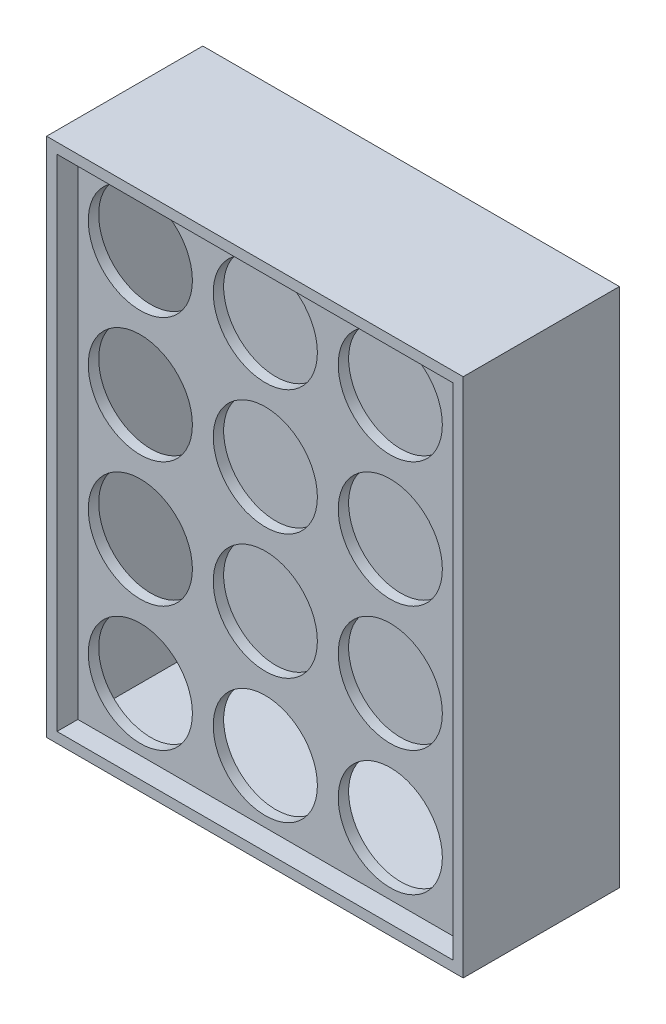
ISO-10303-21;
HEADER;
FILE_DESCRIPTION(('STEP AP214'),'2;1');
FILE_NAME('part.step','',(''),(''),'','','');
FILE_SCHEMA(('AUTOMOTIVE_DESIGN { 1 0 10303 214 1 1 1 1 }'));
ENDSEC;
DATA;
#1=APPLICATION_CONTEXT('core data for automotive mechanical design processes');
#2=APPLICATION_PROTOCOL_DEFINITION('international standard','automotive_design',2000,#1);
#3=PRODUCT_CONTEXT('',#1,'mechanical');
#4=PRODUCT('Part','Part','',(#3));
#5=PRODUCT_RELATED_PRODUCT_CATEGORY('part','',(#4));
#6=PRODUCT_DEFINITION_FORMATION('','',#4);
#7=PRODUCT_DEFINITION_CONTEXT('part definition',#1,'design');
#8=PRODUCT_DEFINITION('design','',#6,#7);
#9=PRODUCT_DEFINITION_SHAPE('','',#8);
#10=(LENGTH_UNIT() NAMED_UNIT(*) SI_UNIT(.MILLI.,.METRE.));
#11=(NAMED_UNIT(*) PLANE_ANGLE_UNIT() SI_UNIT($,.RADIAN.));
#12=(NAMED_UNIT(*) SI_UNIT($,.STERADIAN.) SOLID_ANGLE_UNIT());
#13=UNCERTAINTY_MEASURE_WITH_UNIT(LENGTH_MEASURE(1.E-05),#10,'distance_accuracy_value','');
#14=(GEOMETRIC_REPRESENTATION_CONTEXT(3) GLOBAL_UNCERTAINTY_ASSIGNED_CONTEXT((#13)) GLOBAL_UNIT_ASSIGNED_CONTEXT((#10,
#11,#12)) REPRESENTATION_CONTEXT('',''));
#15=CARTESIAN_POINT('',(0.,0.,0.));
#16=DIRECTION('',(0.,0.,1.));
#17=DIRECTION('',(1.,0.,0.));
#18=AXIS2_PLACEMENT_3D('',#15,#16,#17);
#19=CARTESIAN_POINT('',(0.,0.,5.));
#20=DIRECTION('',(0.,0.,1.));
#21=DIRECTION('',(1.,0.,0.));
#22=AXIS2_PLACEMENT_3D('',#19,#20,#21);
#23=PLANE('',#22);
#24=DIRECTION('',(-1.,0.,0.));
#25=VECTOR('',#24,1.);
#26=CARTESIAN_POINT('',(5.,-5.,5.));
#27=LINE('',#26,#25);
#28=CARTESIAN_POINT('',(195.,-5.,5.));
#29=VERTEX_POINT('',#28);
#30=CARTESIAN_POINT('',(5.,-5.,5.));
#31=VERTEX_POINT('',#30);
#32=EDGE_CURVE('E143',#29,#31,#27,.T.);
#33=ORIENTED_EDGE('',*,*,#32,.T.);
#34=DIRECTION('',(0.,-1.,0.));
#35=VECTOR('',#34,1.);
#36=CARTESIAN_POINT('',(5.,-5.,5.));
#37=LINE('',#36,#35);
#38=CARTESIAN_POINT('',(5.,-245.,5.));
#39=VERTEX_POINT('',#38);
#40=EDGE_CURVE('E174',#31,#39,#37,.T.);
#41=ORIENTED_EDGE('',*,*,#40,.T.);
#42=DIRECTION('',(1.,0.,0.));
#43=VECTOR('',#42,1.);
#44=CARTESIAN_POINT('',(5.,-245.,5.));
#45=LINE('',#44,#43);
#46=CARTESIAN_POINT('',(195.,-245.,5.));
#47=VERTEX_POINT('',#46);
#48=EDGE_CURVE('E177',#39,#47,#45,.T.);
#49=ORIENTED_EDGE('',*,*,#48,.T.);
#50=DIRECTION('',(0.,1.,0.));
#51=VECTOR('',#50,1.);
#52=CARTESIAN_POINT('',(195.,-5.,5.));
#53=LINE('',#52,#51);
#54=EDGE_CURVE('E166',#47,#29,#53,.T.);
#55=ORIENTED_EDGE('',*,*,#54,.T.);
#56=EDGE_LOOP('',(#33,#41,#49,#55));
#57=FACE_BOUND('',#56,.T.);
#58=ADVANCED_FACE('F35',(#57),#23,.T.);
#59=CARTESIAN_POINT('',(195.,-5.,75.));
#60=DIRECTION('',(-1.,0.,0.));
#61=DIRECTION('',(0.,0.,1.));
#62=AXIS2_PLACEMENT_3D('',#59,#60,#61);
#63=PLANE('',#62);
#64=DIRECTION('',(0.,0.,-1.));
#65=VECTOR('',#64,1.);
#66=CARTESIAN_POINT('',(195.,-245.,75.));
#67=LINE('',#66,#65);
#68=CARTESIAN_POINT('',(195.,-245.,60.));
#69=VERTEX_POINT('',#68);
#70=EDGE_CURVE('E135',#69,#47,#67,.T.);
#71=ORIENTED_EDGE('',*,*,#70,.F.);
#72=DIRECTION('',(0.,1.,0.));
#73=VECTOR('',#72,1.);
#74=CARTESIAN_POINT('',(195.,-5.,60.));
#75=LINE('',#74,#73);
#76=CARTESIAN_POINT('',(195.,-5.,60.));
#77=VERTEX_POINT('',#76);
#78=EDGE_CURVE('E157',#69,#77,#75,.T.);
#79=ORIENTED_EDGE('',*,*,#78,.T.);
#80=DIRECTION('',(0.,0.,-1.));
#81=VECTOR('',#80,1.);
#82=CARTESIAN_POINT('',(195.,-5.,75.));
#83=LINE('',#82,#81);
#84=EDGE_CURVE('E136',#77,#29,#83,.T.);
#85=ORIENTED_EDGE('',*,*,#84,.T.);
#86=ORIENTED_EDGE('',*,*,#54,.F.);
#87=EDGE_LOOP('',(#71,#79,#85,#86));
#88=FACE_BOUND('',#87,.T.);
#89=ADVANCED_FACE('F243',(#88),#63,.T.);
#90=CARTESIAN_POINT('',(5.,-245.,75.));
#91=DIRECTION('',(0.,1.,0.));
#92=DIRECTION('',(0.,0.,1.));
#93=AXIS2_PLACEMENT_3D('',#90,#91,#92);
#94=PLANE('',#93);
#95=DIRECTION('',(0.,0.,-1.));
#96=VECTOR('',#95,1.);
#97=CARTESIAN_POINT('',(5.,-245.,75.));
#98=LINE('',#97,#96);
#99=CARTESIAN_POINT('',(5.,-245.,60.));
#100=VERTEX_POINT('',#99);
#101=EDGE_CURVE('E184',#100,#39,#98,.T.);
#102=ORIENTED_EDGE('',*,*,#101,.F.);
#103=DIRECTION('',(1.,0.,0.));
#104=VECTOR('',#103,1.);
#105=CARTESIAN_POINT('',(5.,-245.,60.));
#106=LINE('',#105,#104);
#107=EDGE_CURVE('E153',#100,#69,#106,.T.);
#108=ORIENTED_EDGE('',*,*,#107,.T.);
#109=ORIENTED_EDGE('',*,*,#70,.T.);
#110=ORIENTED_EDGE('',*,*,#48,.F.);
#111=EDGE_LOOP('',(#102,#108,#109,#110));
#112=FACE_BOUND('',#111,.T.);
#113=ADVANCED_FACE('F249',(#112),#94,.T.);
#114=CARTESIAN_POINT('',(5.,-5.,75.));
#115=DIRECTION('',(1.,0.,0.));
#116=DIRECTION('',(0.,0.,-1.));
#117=AXIS2_PLACEMENT_3D('',#114,#115,#116);
#118=PLANE('',#117);
#119=DIRECTION('',(0.,0.,-1.));
#120=VECTOR('',#119,1.);
#121=CARTESIAN_POINT('',(5.,-5.,75.));
#122=LINE('',#121,#120);
#123=CARTESIAN_POINT('',(5.,-5.,60.));
#124=VERTEX_POINT('',#123);
#125=EDGE_CURVE('E187',#124,#31,#122,.T.);
#126=ORIENTED_EDGE('',*,*,#125,.F.);
#127=DIRECTION('',(0.,-1.,0.));
#128=VECTOR('',#127,1.);
#129=CARTESIAN_POINT('',(5.,-5.,60.));
#130=LINE('',#129,#128);
#131=EDGE_CURVE('E150',#124,#100,#130,.T.);
#132=ORIENTED_EDGE('',*,*,#131,.T.);
#133=ORIENTED_EDGE('',*,*,#101,.T.);
#134=ORIENTED_EDGE('',*,*,#40,.F.);
#135=EDGE_LOOP('',(#126,#132,#133,#134));
#136=FACE_BOUND('',#135,.T.);
#137=ADVANCED_FACE('F287',(#136),#118,.T.);
#138=CARTESIAN_POINT('',(5.,-5.,75.));
#139=DIRECTION('',(0.,-1.,0.));
#140=DIRECTION('',(0.,0.,-1.));
#141=AXIS2_PLACEMENT_3D('',#138,#139,#140);
#142=PLANE('',#141);
#143=ORIENTED_EDGE('',*,*,#84,.F.);
#144=DIRECTION('',(-1.,0.,0.));
#145=VECTOR('',#144,1.);
#146=CARTESIAN_POINT('',(5.,-5.,60.));
#147=LINE('',#146,#145);
#148=EDGE_CURVE('E160',#77,#124,#147,.T.);
#149=ORIENTED_EDGE('',*,*,#148,.T.);
#150=ORIENTED_EDGE('',*,*,#125,.T.);
#151=ORIENTED_EDGE('',*,*,#32,.F.);
#152=EDGE_LOOP('',(#143,#149,#150,#151));
#153=FACE_BOUND('',#152,.T.);
#154=ADVANCED_FACE('F279',(#153),#142,.T.);
#155=CARTESIAN_POINT('',(0.,0.,60.));
#156=DIRECTION('',(0.,0.,1.));
#157=DIRECTION('',(1.,0.,0.));
#158=AXIS2_PLACEMENT_3D('',#155,#156,#157);
#159=PLANE('',#158);
#160=CARTESIAN_POINT('',(95.0000000000006,-95.,60.));
#161=DIRECTION('',(0.,0.,1.));
#162=DIRECTION('',(1.,0.,0.));
#163=AXIS2_PLACEMENT_3D('',#160,#161,#162);
#164=CIRCLE('',#163,25.);
#165=CARTESIAN_POINT('',(120.000000000001,-95.,60.));
#166=VERTEX_POINT('',#165);
#167=EDGE_CURVE('E523',#166,#166,#164,.T.);
#168=ORIENTED_EDGE('',*,*,#167,.T.);
#169=EDGE_LOOP('',(#168));
#170=FACE_BOUND('',#169,.T.);
#171=CARTESIAN_POINT('',(35.0000000000019,-215.,60.));
#172=DIRECTION('',(0.,0.,1.));
#173=DIRECTION('',(1.,0.,0.));
#174=AXIS2_PLACEMENT_3D('',#171,#172,#173);
#175=CIRCLE('',#174,25.);
#176=CARTESIAN_POINT('',(60.0000000000019,-215.,60.));
#177=VERTEX_POINT('',#176);
#178=EDGE_CURVE('E527',#177,#177,#175,.T.);
#179=ORIENTED_EDGE('',*,*,#178,.T.);
#180=EDGE_LOOP('',(#179));
#181=FACE_BOUND('',#180,.T.);
#182=CARTESIAN_POINT('',(35.0000000000012,-155.,60.));
#183=DIRECTION('',(0.,0.,1.));
#184=DIRECTION('',(1.,0.,0.));
#185=AXIS2_PLACEMENT_3D('',#182,#183,#184);
#186=CIRCLE('',#185,25.);
#187=CARTESIAN_POINT('',(60.0000000000012,-155.,60.));
#188=VERTEX_POINT('',#187);
#189=EDGE_CURVE('E531',#188,#188,#186,.T.);
#190=ORIENTED_EDGE('',*,*,#189,.T.);
#191=EDGE_LOOP('',(#190));
#192=FACE_BOUND('',#191,.T.);
#193=CARTESIAN_POINT('',(35.0000000000006,-95.,60.));
#194=DIRECTION('',(0.,0.,1.));
#195=DIRECTION('',(1.,0.,0.));
#196=AXIS2_PLACEMENT_3D('',#193,#194,#195);
#197=CIRCLE('',#196,25.);
#198=CARTESIAN_POINT('',(60.0000000000006,-95.,60.));
#199=VERTEX_POINT('',#198);
#200=EDGE_CURVE('E535',#199,#199,#197,.T.);
#201=ORIENTED_EDGE('',*,*,#200,.T.);
#202=EDGE_LOOP('',(#201));
#203=FACE_BOUND('',#202,.T.);
#204=CARTESIAN_POINT('',(155.000000000002,-215.,60.));
#205=DIRECTION('',(0.,0.,1.));
#206=DIRECTION('',(1.,0.,0.));
#207=AXIS2_PLACEMENT_3D('',#204,#205,#206);
#208=CIRCLE('',#207,25.);
#209=CARTESIAN_POINT('',(180.000000000002,-215.,60.));
#210=VERTEX_POINT('',#209);
#211=EDGE_CURVE('E539',#210,#210,#208,.T.);
#212=ORIENTED_EDGE('',*,*,#211,.T.);
#213=EDGE_LOOP('',(#212));
#214=FACE_BOUND('',#213,.T.);
#215=CARTESIAN_POINT('',(95.0000000000019,-215.,60.));
#216=DIRECTION('',(0.,0.,1.));
#217=DIRECTION('',(1.,0.,0.));
#218=AXIS2_PLACEMENT_3D('',#215,#216,#217);
#219=CIRCLE('',#218,25.);
#220=CARTESIAN_POINT('',(120.000000000002,-215.,60.));
#221=VERTEX_POINT('',#220);
#222=EDGE_CURVE('E543',#221,#221,#219,.T.);
#223=ORIENTED_EDGE('',*,*,#222,.T.);
#224=EDGE_LOOP('',(#223));
#225=FACE_BOUND('',#224,.T.);
#226=CARTESIAN_POINT('',(155.000000000001,-155.,60.));
#227=DIRECTION('',(0.,0.,1.));
#228=DIRECTION('',(1.,0.,0.));
#229=AXIS2_PLACEMENT_3D('',#226,#227,#228);
#230=CIRCLE('',#229,25.);
#231=CARTESIAN_POINT('',(180.000000000001,-155.,60.));
#232=VERTEX_POINT('',#231);
#233=EDGE_CURVE('E547',#232,#232,#230,.T.);
#234=ORIENTED_EDGE('',*,*,#233,.T.);
#235=EDGE_LOOP('',(#234));
#236=FACE_BOUND('',#235,.T.);
#237=CARTESIAN_POINT('',(95.0000000000013,-155.,60.));
#238=DIRECTION('',(0.,0.,1.));
#239=DIRECTION('',(1.,0.,0.));
#240=AXIS2_PLACEMENT_3D('',#237,#238,#239);
#241=CIRCLE('',#240,25.);
#242=CARTESIAN_POINT('',(120.000000000001,-155.,60.));
#243=VERTEX_POINT('',#242);
#244=EDGE_CURVE('E551',#243,#243,#241,.T.);
#245=ORIENTED_EDGE('',*,*,#244,.T.);
#246=EDGE_LOOP('',(#245));
#247=FACE_BOUND('',#246,.T.);
#248=CARTESIAN_POINT('',(155.000000000001,-95.,60.));
#249=DIRECTION('',(0.,0.,1.));
#250=DIRECTION('',(1.,0.,0.));
#251=AXIS2_PLACEMENT_3D('',#248,#249,#250);
#252=CIRCLE('',#251,25.);
#253=CARTESIAN_POINT('',(180.000000000001,-95.,60.));
#254=VERTEX_POINT('',#253);
#255=EDGE_CURVE('E555',#254,#254,#252,.T.);
#256=ORIENTED_EDGE('',*,*,#255,.T.);
#257=EDGE_LOOP('',(#256));
#258=FACE_BOUND('',#257,.T.);
#259=CARTESIAN_POINT('',(155.,-35.,60.));
#260=DIRECTION('',(0.,0.,1.));
#261=DIRECTION('',(1.,0.,0.));
#262=AXIS2_PLACEMENT_3D('',#259,#260,#261);
#263=CIRCLE('',#262,25.);
#264=CARTESIAN_POINT('',(180.,-35.,60.));
#265=VERTEX_POINT('',#264);
#266=EDGE_CURVE('E559',#265,#265,#263,.T.);
#267=ORIENTED_EDGE('',*,*,#266,.T.);
#268=EDGE_LOOP('',(#267));
#269=FACE_BOUND('',#268,.T.);
#270=CARTESIAN_POINT('',(95.,-35.,60.));
#271=DIRECTION('',(0.,0.,1.));
#272=DIRECTION('',(1.,0.,0.));
#273=AXIS2_PLACEMENT_3D('',#270,#271,#272);
#274=CIRCLE('',#273,25.);
#275=CARTESIAN_POINT('',(120.,-35.,60.));
#276=VERTEX_POINT('',#275);
#277=EDGE_CURVE('E563',#276,#276,#274,.T.);
#278=ORIENTED_EDGE('',*,*,#277,.T.);
#279=EDGE_LOOP('',(#278));
#280=FACE_BOUND('',#279,.T.);
#281=CARTESIAN_POINT('',(35.,-35.,60.));
#282=DIRECTION('',(0.,0.,1.));
#283=DIRECTION('',(1.,0.,0.));
#284=AXIS2_PLACEMENT_3D('',#281,#282,#283);
#285=CIRCLE('',#284,25.);
#286=CARTESIAN_POINT('',(60.,-35.,60.));
#287=VERTEX_POINT('',#286);
#288=EDGE_CURVE('E154',#287,#287,#285,.T.);
#289=ORIENTED_EDGE('',*,*,#288,.T.);
#290=EDGE_LOOP('',(#289));
#291=FACE_BOUND('',#290,.T.);
#292=ORIENTED_EDGE('',*,*,#131,.F.);
#293=ORIENTED_EDGE('',*,*,#148,.F.);
#294=ORIENTED_EDGE('',*,*,#78,.F.);
#295=ORIENTED_EDGE('',*,*,#107,.F.);
#296=EDGE_LOOP('',(#292,#293,#294,#295));
#297=FACE_BOUND('',#296,.T.);
#298=ADVANCED_FACE('F414',(#170,#181,#192,#203,#214,#225,#236,#247,#258,#269,#280,#291,#297),
#159,.F.);
#299=CARTESIAN_POINT('',(35.,-35.,60.));
#300=DIRECTION('',(0.,0.,1.));
#301=DIRECTION('',(1.,0.,0.));
#302=AXIS2_PLACEMENT_3D('',#299,#300,#301);
#303=CYLINDRICAL_SURFACE('',#302,25.);
#304=ORIENTED_EDGE('',*,*,#288,.F.);
#305=EDGE_LOOP('',(#304));
#306=FACE_BOUND('',#305,.T.);
#307=CARTESIAN_POINT('',(35.,-35.,65.));
#308=DIRECTION('',(0.,0.,1.));
#309=DIRECTION('',(1.,0.,0.));
#310=AXIS2_PLACEMENT_3D('',#307,#308,#309);
#311=CIRCLE('',#310,25.);
#312=CARTESIAN_POINT('',(60.,-35.,65.));
#313=VERTEX_POINT('',#312);
#314=EDGE_CURVE('E566',#313,#313,#311,.T.);
#315=ORIENTED_EDGE('',*,*,#314,.T.);
#316=EDGE_LOOP('',(#315));
#317=FACE_BOUND('',#316,.T.);
#318=ADVANCED_FACE('F405',(#306,#317),#303,.F.);
#319=CARTESIAN_POINT('',(95.,-35.,60.));
#320=DIRECTION('',(0.,0.,1.));
#321=DIRECTION('',(1.,0.,0.));
#322=AXIS2_PLACEMENT_3D('',#319,#320,#321);
#323=CYLINDRICAL_SURFACE('',#322,25.);
#324=ORIENTED_EDGE('',*,*,#277,.F.);
#325=EDGE_LOOP('',(#324));
#326=FACE_BOUND('',#325,.T.);
#327=CARTESIAN_POINT('',(95.,-35.,65.));
#328=DIRECTION('',(0.,0.,1.));
#329=DIRECTION('',(1.,0.,0.));
#330=AXIS2_PLACEMENT_3D('',#327,#328,#329);
#331=CIRCLE('',#330,25.);
#332=CARTESIAN_POINT('',(120.,-35.,65.));
#333=VERTEX_POINT('',#332);
#334=EDGE_CURVE('E611',#333,#333,#331,.T.);
#335=ORIENTED_EDGE('',*,*,#334,.T.);
#336=EDGE_LOOP('',(#335));
#337=FACE_BOUND('',#336,.T.);
#338=ADVANCED_FACE('F396',(#326,#337),#323,.F.);
#339=CARTESIAN_POINT('',(155.,-35.,60.));
#340=DIRECTION('',(0.,0.,1.));
#341=DIRECTION('',(1.,0.,0.));
#342=AXIS2_PLACEMENT_3D('',#339,#340,#341);
#343=CYLINDRICAL_SURFACE('',#342,25.);
#344=ORIENTED_EDGE('',*,*,#266,.F.);
#345=EDGE_LOOP('',(#344));
#346=FACE_BOUND('',#345,.T.);
#347=CARTESIAN_POINT('',(155.,-35.,65.));
#348=DIRECTION('',(0.,0.,1.));
#349=DIRECTION('',(1.,0.,0.));
#350=AXIS2_PLACEMENT_3D('',#347,#348,#349);
#351=CIRCLE('',#350,25.);
#352=CARTESIAN_POINT('',(180.,-35.,65.));
#353=VERTEX_POINT('',#352);
#354=EDGE_CURVE('E607',#353,#353,#351,.T.);
#355=ORIENTED_EDGE('',*,*,#354,.T.);
#356=EDGE_LOOP('',(#355));
#357=FACE_BOUND('',#356,.T.);
#358=ADVANCED_FACE('F387',(#346,#357),#343,.F.);
#359=CARTESIAN_POINT('',(155.000000000001,-95.,60.));
#360=DIRECTION('',(0.,0.,1.));
#361=DIRECTION('',(1.,0.,0.));
#362=AXIS2_PLACEMENT_3D('',#359,#360,#361);
#363=CYLINDRICAL_SURFACE('',#362,25.);
#364=ORIENTED_EDGE('',*,*,#255,.F.);
#365=EDGE_LOOP('',(#364));
#366=FACE_BOUND('',#365,.T.);
#367=CARTESIAN_POINT('',(155.000000000001,-95.,65.));
#368=DIRECTION('',(0.,0.,1.));
#369=DIRECTION('',(1.,0.,0.));
#370=AXIS2_PLACEMENT_3D('',#367,#368,#369);
#371=CIRCLE('',#370,25.);
#372=CARTESIAN_POINT('',(180.000000000001,-95.,65.));
#373=VERTEX_POINT('',#372);
#374=EDGE_CURVE('E599',#373,#373,#371,.T.);
#375=ORIENTED_EDGE('',*,*,#374,.T.);
#376=EDGE_LOOP('',(#375));
#377=FACE_BOUND('',#376,.T.);
#378=ADVANCED_FACE('F378',(#366,#377),#363,.F.);
#379=CARTESIAN_POINT('',(95.0000000000013,-155.,60.));
#380=DIRECTION('',(0.,0.,1.));
#381=DIRECTION('',(1.,0.,0.));
#382=AXIS2_PLACEMENT_3D('',#379,#380,#381);
#383=CYLINDRICAL_SURFACE('',#382,25.);
#384=ORIENTED_EDGE('',*,*,#244,.F.);
#385=EDGE_LOOP('',(#384));
#386=FACE_BOUND('',#385,.T.);
#387=CARTESIAN_POINT('',(95.0000000000013,-155.,65.));
#388=DIRECTION('',(0.,0.,1.));
#389=DIRECTION('',(1.,0.,0.));
#390=AXIS2_PLACEMENT_3D('',#387,#388,#389);
#391=CIRCLE('',#390,25.);
#392=CARTESIAN_POINT('',(120.000000000001,-155.,65.));
#393=VERTEX_POINT('',#392);
#394=EDGE_CURVE('E595',#393,#393,#391,.T.);
#395=ORIENTED_EDGE('',*,*,#394,.T.);
#396=EDGE_LOOP('',(#395));
#397=FACE_BOUND('',#396,.T.);
#398=ADVANCED_FACE('F369',(#386,#397),#383,.F.);
#399=CARTESIAN_POINT('',(155.000000000001,-155.,60.));
#400=DIRECTION('',(0.,0.,1.));
#401=DIRECTION('',(1.,0.,0.));
#402=AXIS2_PLACEMENT_3D('',#399,#400,#401);
#403=CYLINDRICAL_SURFACE('',#402,25.);
#404=ORIENTED_EDGE('',*,*,#233,.F.);
#405=EDGE_LOOP('',(#404));
#406=FACE_BOUND('',#405,.T.);
#407=CARTESIAN_POINT('',(155.000000000001,-155.,65.));
#408=DIRECTION('',(0.,0.,1.));
#409=DIRECTION('',(1.,0.,0.));
#410=AXIS2_PLACEMENT_3D('',#407,#408,#409);
#411=CIRCLE('',#410,25.);
#412=CARTESIAN_POINT('',(180.000000000001,-155.,65.));
#413=VERTEX_POINT('',#412);
#414=EDGE_CURVE('E591',#413,#413,#411,.T.);
#415=ORIENTED_EDGE('',*,*,#414,.T.);
#416=EDGE_LOOP('',(#415));
#417=FACE_BOUND('',#416,.T.);
#418=ADVANCED_FACE('F360',(#406,#417),#403,.F.);
#419=CARTESIAN_POINT('',(95.0000000000019,-215.,60.));
#420=DIRECTION('',(0.,0.,1.));
#421=DIRECTION('',(1.,0.,0.));
#422=AXIS2_PLACEMENT_3D('',#419,#420,#421);
#423=CYLINDRICAL_SURFACE('',#422,25.);
#424=ORIENTED_EDGE('',*,*,#222,.F.);
#425=EDGE_LOOP('',(#424));
#426=FACE_BOUND('',#425,.T.);
#427=CARTESIAN_POINT('',(95.0000000000019,-215.,65.));
#428=DIRECTION('',(0.,0.,1.));
#429=DIRECTION('',(1.,0.,0.));
#430=AXIS2_PLACEMENT_3D('',#427,#428,#429);
#431=CIRCLE('',#430,25.);
#432=CARTESIAN_POINT('',(120.000000000002,-215.,65.));
#433=VERTEX_POINT('',#432);
#434=EDGE_CURVE('E587',#433,#433,#431,.T.);
#435=ORIENTED_EDGE('',*,*,#434,.T.);
#436=EDGE_LOOP('',(#435));
#437=FACE_BOUND('',#436,.T.);
#438=ADVANCED_FACE('F351',(#426,#437),#423,.F.);
#439=CARTESIAN_POINT('',(155.000000000002,-215.,60.));
#440=DIRECTION('',(0.,0.,1.));
#441=DIRECTION('',(1.,0.,0.));
#442=AXIS2_PLACEMENT_3D('',#439,#440,#441);
#443=CYLINDRICAL_SURFACE('',#442,25.);
#444=ORIENTED_EDGE('',*,*,#211,.F.);
#445=EDGE_LOOP('',(#444));
#446=FACE_BOUND('',#445,.T.);
#447=CARTESIAN_POINT('',(155.000000000002,-215.,65.));
#448=DIRECTION('',(0.,0.,1.));
#449=DIRECTION('',(1.,0.,0.));
#450=AXIS2_PLACEMENT_3D('',#447,#448,#449);
#451=CIRCLE('',#450,25.);
#452=CARTESIAN_POINT('',(180.000000000002,-215.,65.));
#453=VERTEX_POINT('',#452);
#454=EDGE_CURVE('E583',#453,#453,#451,.T.);
#455=ORIENTED_EDGE('',*,*,#454,.T.);
#456=EDGE_LOOP('',(#455));
#457=FACE_BOUND('',#456,.T.);
#458=ADVANCED_FACE('F342',(#446,#457),#443,.F.);
#459=CARTESIAN_POINT('',(35.0000000000006,-95.,60.));
#460=DIRECTION('',(0.,0.,1.));
#461=DIRECTION('',(1.,0.,0.));
#462=AXIS2_PLACEMENT_3D('',#459,#460,#461);
#463=CYLINDRICAL_SURFACE('',#462,25.);
#464=ORIENTED_EDGE('',*,*,#200,.F.);
#465=EDGE_LOOP('',(#464));
#466=FACE_BOUND('',#465,.T.);
#467=CARTESIAN_POINT('',(35.0000000000006,-95.,65.));
#468=DIRECTION('',(0.,0.,1.));
#469=DIRECTION('',(1.,0.,0.));
#470=AXIS2_PLACEMENT_3D('',#467,#468,#469);
#471=CIRCLE('',#470,25.);
#472=CARTESIAN_POINT('',(60.0000000000006,-95.,65.));
#473=VERTEX_POINT('',#472);
#474=EDGE_CURVE('E579',#473,#473,#471,.T.);
#475=ORIENTED_EDGE('',*,*,#474,.T.);
#476=EDGE_LOOP('',(#475));
#477=FACE_BOUND('',#476,.T.);
#478=ADVANCED_FACE('F333',(#466,#477),#463,.F.);
#479=CARTESIAN_POINT('',(35.0000000000012,-155.,60.));
#480=DIRECTION('',(0.,0.,1.));
#481=DIRECTION('',(1.,0.,0.));
#482=AXIS2_PLACEMENT_3D('',#479,#480,#481);
#483=CYLINDRICAL_SURFACE('',#482,25.);
#484=ORIENTED_EDGE('',*,*,#189,.F.);
#485=EDGE_LOOP('',(#484));
#486=FACE_BOUND('',#485,.T.);
#487=CARTESIAN_POINT('',(35.0000000000012,-155.,65.));
#488=DIRECTION('',(0.,0.,1.));
#489=DIRECTION('',(1.,0.,0.));
#490=AXIS2_PLACEMENT_3D('',#487,#488,#489);
#491=CIRCLE('',#490,25.);
#492=CARTESIAN_POINT('',(60.0000000000012,-155.,65.));
#493=VERTEX_POINT('',#492);
#494=EDGE_CURVE('E575',#493,#493,#491,.T.);
#495=ORIENTED_EDGE('',*,*,#494,.T.);
#496=EDGE_LOOP('',(#495));
#497=FACE_BOUND('',#496,.T.);
#498=ADVANCED_FACE('F324',(#486,#497),#483,.F.);
#499=CARTESIAN_POINT('',(35.0000000000019,-215.,60.));
#500=DIRECTION('',(0.,0.,1.));
#501=DIRECTION('',(1.,0.,0.));
#502=AXIS2_PLACEMENT_3D('',#499,#500,#501);
#503=CYLINDRICAL_SURFACE('',#502,25.);
#504=ORIENTED_EDGE('',*,*,#178,.F.);
#505=EDGE_LOOP('',(#504));
#506=FACE_BOUND('',#505,.T.);
#507=CARTESIAN_POINT('',(35.0000000000019,-215.,65.));
#508=DIRECTION('',(0.,0.,1.));
#509=DIRECTION('',(1.,0.,0.));
#510=AXIS2_PLACEMENT_3D('',#507,#508,#509);
#511=CIRCLE('',#510,25.);
#512=CARTESIAN_POINT('',(60.0000000000019,-215.,65.));
#513=VERTEX_POINT('',#512);
#514=EDGE_CURVE('E571',#513,#513,#511,.T.);
#515=ORIENTED_EDGE('',*,*,#514,.T.);
#516=EDGE_LOOP('',(#515));
#517=FACE_BOUND('',#516,.T.);
#518=ADVANCED_FACE('F241',(#506,#517),#503,.F.);
#519=CARTESIAN_POINT('',(0.,0.,5.));
#520=DIRECTION('',(1.,0.,0.));
#521=DIRECTION('',(0.,1.,0.));
#522=AXIS2_PLACEMENT_3D('',#519,#520,#521);
#523=PLANE('',#522);
#524=DIRECTION('',(0.,-1.,0.));
#525=VECTOR('',#524,1.);
#526=CARTESIAN_POINT('',(0.,0.,0.));
#527=LINE('',#526,#525);
#528=CARTESIAN_POINT('',(0.,0.,0.));
#529=VERTEX_POINT('',#528);
#530=CARTESIAN_POINT('',(0.,-250.,0.));
#531=VERTEX_POINT('',#530);
#532=EDGE_CURVE('E201',#529,#531,#527,.T.);
#533=ORIENTED_EDGE('',*,*,#532,.T.);
#534=DIRECTION('',(0.,0.,-1.));
#535=VECTOR('',#534,1.);
#536=CARTESIAN_POINT('',(0.,-250.,5.));
#537=LINE('',#536,#535);
#538=CARTESIAN_POINT('',(0.,-250.,75.));
#539=VERTEX_POINT('',#538);
#540=EDGE_CURVE('E11',#539,#531,#537,.T.);
#541=ORIENTED_EDGE('',*,*,#540,.F.);
#542=DIRECTION('',(0.,-1.,0.));
#543=VECTOR('',#542,1.);
#544=CARTESIAN_POINT('',(0.,0.,75.));
#545=LINE('',#544,#543);
#546=CARTESIAN_POINT('',(0.,0.,75.));
#547=VERTEX_POINT('',#546);
#548=EDGE_CURVE('E189',#547,#539,#545,.T.);
#549=ORIENTED_EDGE('',*,*,#548,.F.);
#550=DIRECTION('',(0.,0.,-1.));
#551=VECTOR('',#550,1.);
#552=CARTESIAN_POINT('',(0.,0.,5.));
#553=LINE('',#552,#551);
#554=EDGE_CURVE('E210',#547,#529,#553,.T.);
#555=ORIENTED_EDGE('',*,*,#554,.T.);
#556=EDGE_LOOP('',(#533,#541,#549,#555));
#557=FACE_BOUND('',#556,.T.);
#558=ADVANCED_FACE('F37',(#557),#523,.F.);
#559=CARTESIAN_POINT('',(0.,-250.,5.));
#560=DIRECTION('',(0.,1.,0.));
#561=DIRECTION('',(0.,0.,1.));
#562=AXIS2_PLACEMENT_3D('',#559,#560,#561);
#563=PLANE('',#562);
#564=DIRECTION('',(1.,0.,0.));
#565=VECTOR('',#564,1.);
#566=CARTESIAN_POINT('',(0.,-250.,0.));
#567=LINE('',#566,#565);
#568=CARTESIAN_POINT('',(200.,-250.,0.));
#569=VERTEX_POINT('',#568);
#570=EDGE_CURVE('E204',#531,#569,#567,.T.);
#571=ORIENTED_EDGE('',*,*,#570,.T.);
#572=DIRECTION('',(0.,0.,-1.));
#573=VECTOR('',#572,1.);
#574=CARTESIAN_POINT('',(200.,-250.,5.));
#575=LINE('',#574,#573);
#576=CARTESIAN_POINT('',(200.,-250.,75.));
#577=VERTEX_POINT('',#576);
#578=EDGE_CURVE('E43',#577,#569,#575,.T.);
#579=ORIENTED_EDGE('',*,*,#578,.F.);
#580=DIRECTION('',(1.,0.,0.));
#581=VECTOR('',#580,1.);
#582=CARTESIAN_POINT('',(0.,-250.,75.));
#583=LINE('',#582,#581);
#584=EDGE_CURVE('E192',#539,#577,#583,.T.);
#585=ORIENTED_EDGE('',*,*,#584,.F.);
#586=ORIENTED_EDGE('',*,*,#540,.T.);
#587=EDGE_LOOP('',(#571,#579,#585,#586));
#588=FACE_BOUND('',#587,.T.);
#589=ADVANCED_FACE('F234',(#588),#563,.F.);
#590=CARTESIAN_POINT('',(200.,0.,5.));
#591=DIRECTION('',(-1.,0.,0.));
#592=DIRECTION('',(0.,-1.,0.));
#593=AXIS2_PLACEMENT_3D('',#590,#591,#592);
#594=PLANE('',#593);
#595=DIRECTION('',(0.,1.,0.));
#596=VECTOR('',#595,1.);
#597=CARTESIAN_POINT('',(200.,0.,0.));
#598=LINE('',#597,#596);
#599=CARTESIAN_POINT('',(200.,0.,0.));
#600=VERTEX_POINT('',#599);
#601=EDGE_CURVE('E206',#569,#600,#598,.T.);
#602=ORIENTED_EDGE('',*,*,#601,.T.);
#603=DIRECTION('',(0.,0.,-1.));
#604=VECTOR('',#603,1.);
#605=CARTESIAN_POINT('',(200.,0.,5.));
#606=LINE('',#605,#604);
#607=CARTESIAN_POINT('',(200.,0.,75.));
#608=VERTEX_POINT('',#607);
#609=EDGE_CURVE('E213',#608,#600,#606,.T.);
#610=ORIENTED_EDGE('',*,*,#609,.F.);
#611=DIRECTION('',(0.,1.,0.));
#612=VECTOR('',#611,1.);
#613=CARTESIAN_POINT('',(200.,0.,75.));
#614=LINE('',#613,#612);
#615=EDGE_CURVE('E195',#577,#608,#614,.T.);
#616=ORIENTED_EDGE('',*,*,#615,.F.);
#617=ORIENTED_EDGE('',*,*,#578,.T.);
#618=EDGE_LOOP('',(#602,#610,#616,#617));
#619=FACE_BOUND('',#618,.T.);
#620=ADVANCED_FACE('F219',(#619),#594,.F.);
#621=CARTESIAN_POINT('',(0.,0.,5.));
#622=DIRECTION('',(0.,-1.,0.));
#623=DIRECTION('',(0.,0.,-1.));
#624=AXIS2_PLACEMENT_3D('',#621,#622,#623);
#625=PLANE('',#624);
#626=DIRECTION('',(-1.,0.,0.));
#627=VECTOR('',#626,1.);
#628=CARTESIAN_POINT('',(0.,0.,0.));
#629=LINE('',#628,#627);
#630=EDGE_CURVE('E208',#600,#529,#629,.T.);
#631=ORIENTED_EDGE('',*,*,#630,.T.);
#632=ORIENTED_EDGE('',*,*,#554,.F.);
#633=DIRECTION('',(-1.,0.,0.));
#634=VECTOR('',#633,1.);
#635=CARTESIAN_POINT('',(0.,0.,75.));
#636=LINE('',#635,#634);
#637=EDGE_CURVE('E198',#608,#547,#636,.T.);
#638=ORIENTED_EDGE('',*,*,#637,.F.);
#639=ORIENTED_EDGE('',*,*,#609,.T.);
#640=EDGE_LOOP('',(#631,#632,#638,#639));
#641=FACE_BOUND('',#640,.T.);
#642=ADVANCED_FACE('F227',(#641),#625,.F.);
#643=CARTESIAN_POINT('',(0.,0.,0.));
#644=DIRECTION('',(0.,0.,1.));
#645=DIRECTION('',(1.,0.,0.));
#646=AXIS2_PLACEMENT_3D('',#643,#644,#645);
#647=PLANE('',#646);
#648=ORIENTED_EDGE('',*,*,#532,.F.);
#649=ORIENTED_EDGE('',*,*,#630,.F.);
#650=ORIENTED_EDGE('',*,*,#601,.F.);
#651=ORIENTED_EDGE('',*,*,#570,.F.);
#652=EDGE_LOOP('',(#648,#649,#650,#651));
#653=FACE_BOUND('',#652,.T.);
#654=ADVANCED_FACE('F225',(#653),#647,.F.);
#655=CARTESIAN_POINT('',(0.,0.,75.));
#656=DIRECTION('',(0.,0.,1.));
#657=DIRECTION('',(1.,0.,0.));
#658=AXIS2_PLACEMENT_3D('',#655,#656,#657);
#659=PLANE('',#658);
#660=ORIENTED_EDGE('',*,*,#548,.T.);
#661=ORIENTED_EDGE('',*,*,#584,.T.);
#662=ORIENTED_EDGE('',*,*,#615,.T.);
#663=ORIENTED_EDGE('',*,*,#637,.T.);
#664=EDGE_LOOP('',(#660,#661,#662,#663));
#665=FACE_BOUND('',#664,.T.);
#666=DIRECTION('',(0.,-1.,0.));
#667=VECTOR('',#666,1.);
#668=CARTESIAN_POINT('',(5.,-5.,75.));
#669=LINE('',#668,#667);
#670=CARTESIAN_POINT('',(5.,-5.,75.));
#671=VERTEX_POINT('',#670);
#672=CARTESIAN_POINT('',(5.,-245.,75.));
#673=VERTEX_POINT('',#672);
#674=EDGE_CURVE('E165',#671,#673,#669,.T.);
#675=ORIENTED_EDGE('',*,*,#674,.F.);
#676=DIRECTION('',(-1.,0.,0.));
#677=VECTOR('',#676,1.);
#678=CARTESIAN_POINT('',(5.,-5.,75.));
#679=LINE('',#678,#677);
#680=CARTESIAN_POINT('',(195.,-5.,75.));
#681=VERTEX_POINT('',#680);
#682=EDGE_CURVE('E163',#681,#671,#679,.T.);
#683=ORIENTED_EDGE('',*,*,#682,.F.);
#684=DIRECTION('',(0.,1.,0.));
#685=VECTOR('',#684,1.);
#686=CARTESIAN_POINT('',(195.,-5.,75.));
#687=LINE('',#686,#685);
#688=CARTESIAN_POINT('',(195.,-245.,75.));
#689=VERTEX_POINT('',#688);
#690=EDGE_CURVE('E132',#689,#681,#687,.T.);
#691=ORIENTED_EDGE('',*,*,#690,.F.);
#692=DIRECTION('',(1.,0.,0.));
#693=VECTOR('',#692,1.);
#694=CARTESIAN_POINT('',(5.,-245.,75.));
#695=LINE('',#694,#693);
#696=EDGE_CURVE('E168',#673,#689,#695,.T.);
#697=ORIENTED_EDGE('',*,*,#696,.F.);
#698=EDGE_LOOP('',(#675,#683,#691,#697));
#699=FACE_BOUND('',#698,.T.);
#700=ADVANCED_FACE('F232',(#665,#699),#659,.T.);
#701=DIRECTION('',(-1.,0.,0.));
#702=VECTOR('',#701,1.);
#703=CARTESIAN_POINT('',(5.,-5.,65.));
#704=LINE('',#703,#702);
#705=CARTESIAN_POINT('',(195.,-5.,65.));
#706=VERTEX_POINT('',#705);
#707=CARTESIAN_POINT('',(5.,-5.,65.));
#708=VERTEX_POINT('',#707);
#709=EDGE_CURVE('E139',#706,#708,#704,.T.);
#710=ORIENTED_EDGE('',*,*,#709,.F.);
#711=EDGE_CURVE('E126',#681,#706,#83,.T.);
#712=ORIENTED_EDGE('',*,*,#711,.F.);
#713=ORIENTED_EDGE('',*,*,#682,.T.);
#714=EDGE_CURVE('E141',#671,#708,#122,.T.);
#715=ORIENTED_EDGE('',*,*,#714,.T.);
#716=EDGE_LOOP('',(#710,#712,#713,#715));
#717=FACE_BOUND('',#716,.T.);
#718=ADVANCED_FACE('F140',(#717),#142,.T.);
#719=DIRECTION('',(0.,-1.,0.));
#720=VECTOR('',#719,1.);
#721=CARTESIAN_POINT('',(5.,-5.,65.));
#722=LINE('',#721,#720);
#723=CARTESIAN_POINT('',(5.,-245.,65.));
#724=VERTEX_POINT('',#723);
#725=EDGE_CURVE('E50',#708,#724,#722,.T.);
#726=ORIENTED_EDGE('',*,*,#725,.F.);
#727=ORIENTED_EDGE('',*,*,#714,.F.);
#728=ORIENTED_EDGE('',*,*,#674,.T.);
#729=EDGE_CURVE('E185',#673,#724,#98,.T.);
#730=ORIENTED_EDGE('',*,*,#729,.T.);
#731=EDGE_LOOP('',(#726,#727,#728,#730));
#732=FACE_BOUND('',#731,.T.);
#733=ADVANCED_FACE('F278',(#732),#118,.T.);
#734=DIRECTION('',(1.,0.,0.));
#735=VECTOR('',#734,1.);
#736=CARTESIAN_POINT('',(5.,-245.,65.));
#737=LINE('',#736,#735);
#738=CARTESIAN_POINT('',(195.,-245.,65.));
#739=VERTEX_POINT('',#738);
#740=EDGE_CURVE('E58',#724,#739,#737,.T.);
#741=ORIENTED_EDGE('',*,*,#740,.F.);
#742=ORIENTED_EDGE('',*,*,#729,.F.);
#743=ORIENTED_EDGE('',*,*,#696,.T.);
#744=EDGE_CURVE('E182',#689,#739,#67,.T.);
#745=ORIENTED_EDGE('',*,*,#744,.T.);
#746=EDGE_LOOP('',(#741,#742,#743,#745));
#747=FACE_BOUND('',#746,.T.);
#748=ADVANCED_FACE('F285',(#747),#94,.T.);
#749=DIRECTION('',(0.,1.,0.));
#750=VECTOR('',#749,1.);
#751=CARTESIAN_POINT('',(195.,-5.,65.));
#752=LINE('',#751,#750);
#753=EDGE_CURVE('E130',#739,#706,#752,.T.);
#754=ORIENTED_EDGE('',*,*,#753,.F.);
#755=ORIENTED_EDGE('',*,*,#744,.F.);
#756=ORIENTED_EDGE('',*,*,#690,.T.);
#757=ORIENTED_EDGE('',*,*,#711,.T.);
#758=EDGE_LOOP('',(#754,#755,#756,#757));
#759=FACE_BOUND('',#758,.T.);
#760=ADVANCED_FACE('F128',(#759),#63,.T.);
#761=CARTESIAN_POINT('',(0.,0.,65.));
#762=DIRECTION('',(0.,0.,1.));
#763=DIRECTION('',(1.,0.,0.));
#764=AXIS2_PLACEMENT_3D('',#761,#762,#763);
#765=PLANE('',#764);
#766=CARTESIAN_POINT('',(95.0000000000006,-95.,65.));
#767=DIRECTION('',(0.,0.,1.));
#768=DIRECTION('',(1.,0.,0.));
#769=AXIS2_PLACEMENT_3D('',#766,#767,#768);
#770=CIRCLE('',#769,25.);
#771=CARTESIAN_POINT('',(120.000000000001,-95.,65.));
#772=VERTEX_POINT('',#771);
#773=EDGE_CURVE('E603',#772,#772,#770,.T.);
#774=ORIENTED_EDGE('',*,*,#773,.F.);
#775=EDGE_LOOP('',(#774));
#776=FACE_BOUND('',#775,.T.);
#777=ORIENTED_EDGE('',*,*,#514,.F.);
#778=EDGE_LOOP('',(#777));
#779=FACE_BOUND('',#778,.T.);
#780=ORIENTED_EDGE('',*,*,#494,.F.);
#781=EDGE_LOOP('',(#780));
#782=FACE_BOUND('',#781,.T.);
#783=ORIENTED_EDGE('',*,*,#474,.F.);
#784=EDGE_LOOP('',(#783));
#785=FACE_BOUND('',#784,.T.);
#786=ORIENTED_EDGE('',*,*,#454,.F.);
#787=EDGE_LOOP('',(#786));
#788=FACE_BOUND('',#787,.T.);
#789=ORIENTED_EDGE('',*,*,#434,.F.);
#790=EDGE_LOOP('',(#789));
#791=FACE_BOUND('',#790,.T.);
#792=ORIENTED_EDGE('',*,*,#414,.F.);
#793=EDGE_LOOP('',(#792));
#794=FACE_BOUND('',#793,.T.);
#795=ORIENTED_EDGE('',*,*,#394,.F.);
#796=EDGE_LOOP('',(#795));
#797=FACE_BOUND('',#796,.T.);
#798=ORIENTED_EDGE('',*,*,#374,.F.);
#799=EDGE_LOOP('',(#798));
#800=FACE_BOUND('',#799,.T.);
#801=ORIENTED_EDGE('',*,*,#354,.F.);
#802=EDGE_LOOP('',(#801));
#803=FACE_BOUND('',#802,.T.);
#804=ORIENTED_EDGE('',*,*,#334,.F.);
#805=EDGE_LOOP('',(#804));
#806=FACE_BOUND('',#805,.T.);
#807=ORIENTED_EDGE('',*,*,#314,.F.);
#808=EDGE_LOOP('',(#807));
#809=FACE_BOUND('',#808,.T.);
#810=ORIENTED_EDGE('',*,*,#725,.T.);
#811=ORIENTED_EDGE('',*,*,#740,.T.);
#812=ORIENTED_EDGE('',*,*,#753,.T.);
#813=ORIENTED_EDGE('',*,*,#709,.T.);
#814=EDGE_LOOP('',(#810,#811,#812,#813));
#815=FACE_BOUND('',#814,.T.);
#816=ADVANCED_FACE('F145',(#776,#779,#782,#785,#788,#791,#794,#797,#800,#803,#806,#809,#815),
#765,.T.);
#817=CARTESIAN_POINT('',(95.0000000000006,-95.,60.));
#818=DIRECTION('',(0.,0.,1.));
#819=DIRECTION('',(1.,0.,0.));
#820=AXIS2_PLACEMENT_3D('',#817,#818,#819);
#821=CYLINDRICAL_SURFACE('',#820,25.);
#822=ORIENTED_EDGE('',*,*,#167,.F.);
#823=EDGE_LOOP('',(#822));
#824=FACE_BOUND('',#823,.T.);
#825=ORIENTED_EDGE('',*,*,#773,.T.);
#826=EDGE_LOOP('',(#825));
#827=FACE_BOUND('',#826,.T.);
#828=ADVANCED_FACE('F305',(#824,#827),#821,.F.);
#829=CLOSED_SHELL('',(#58,#89,#113,#137,#154,#298,#318,#338,#358,#378,#398,#418,#438,#458,#478,
#498,#518,#558,#589,#620,#642,#654,#700,#718,#733,#748,#760,#816,#828));
#830=MANIFOLD_SOLID_BREP('B2',#829);
#831=ADVANCED_BREP_SHAPE_REPRESENTATION('',(#18,#830),#14);
#832=SHAPE_DEFINITION_REPRESENTATION(#9,#831);
ENDSEC;
END-ISO-10303-21;
